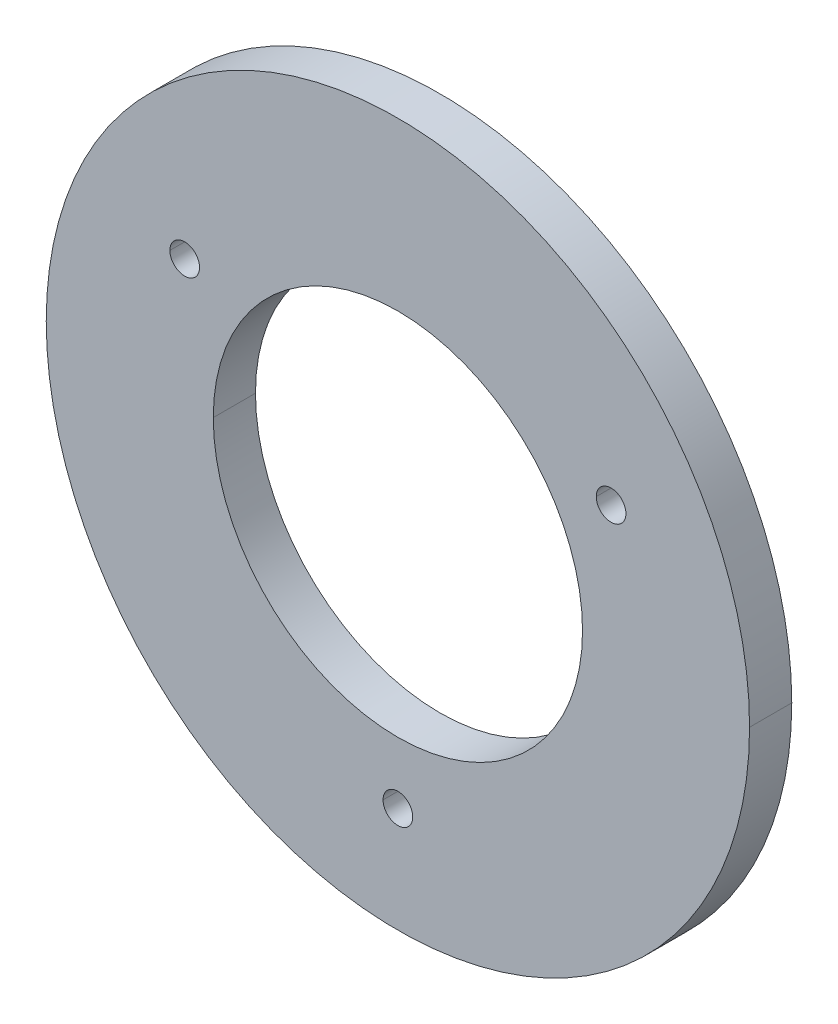
ISO-10303-21;
HEADER;
FILE_DESCRIPTION(('STEP AP214'),'2;1');
FILE_NAME('part.step','',(''),(''),'','','');
FILE_SCHEMA(('AUTOMOTIVE_DESIGN { 1 0 10303 214 1 1 1 1 }'));
ENDSEC;
DATA;
#1=APPLICATION_CONTEXT('core data for automotive mechanical design processes');
#2=APPLICATION_PROTOCOL_DEFINITION('international standard','automotive_design',2000,#1);
#3=PRODUCT_CONTEXT('',#1,'mechanical');
#4=PRODUCT('Part','Part','',(#3));
#5=PRODUCT_RELATED_PRODUCT_CATEGORY('part','',(#4));
#6=PRODUCT_DEFINITION_FORMATION('','',#4);
#7=PRODUCT_DEFINITION_CONTEXT('part definition',#1,'design');
#8=PRODUCT_DEFINITION('design','',#6,#7);
#9=PRODUCT_DEFINITION_SHAPE('','',#8);
#10=(LENGTH_UNIT() NAMED_UNIT(*) SI_UNIT(.MILLI.,.METRE.));
#11=(NAMED_UNIT(*) PLANE_ANGLE_UNIT() SI_UNIT($,.RADIAN.));
#12=(NAMED_UNIT(*) SI_UNIT($,.STERADIAN.) SOLID_ANGLE_UNIT());
#13=UNCERTAINTY_MEASURE_WITH_UNIT(LENGTH_MEASURE(1.E-05),#10,'distance_accuracy_value','');
#14=(GEOMETRIC_REPRESENTATION_CONTEXT(3) GLOBAL_UNCERTAINTY_ASSIGNED_CONTEXT((#13)) GLOBAL_UNIT_ASSIGNED_CONTEXT((#10,
#11,#12)) REPRESENTATION_CONTEXT('',''));
#15=CARTESIAN_POINT('',(0.,0.,0.));
#16=DIRECTION('',(0.,0.,1.));
#17=DIRECTION('',(1.,0.,0.));
#18=AXIS2_PLACEMENT_3D('',#15,#16,#17);
#19=CARTESIAN_POINT('',(6.2450045135165E-13,-88.9,0.));
#20=DIRECTION('',(0.,0.,1.));
#21=DIRECTION('',(1.,0.,0.));
#22=AXIS2_PLACEMENT_3D('',#19,#20,#21);
#23=CYLINDRICAL_SURFACE('',#22,5.35813);
#24=DIRECTION('',(0.,0.,1.));
#25=VECTOR('',#24,1.);
#26=CARTESIAN_POINT('',(-5.35812999999937,-88.9,0.));
#27=LINE('',#26,#25);
#28=CARTESIAN_POINT('',(-5.35812999999937,-88.9,-15.24));
#29=VERTEX_POINT('',#28);
#30=CARTESIAN_POINT('',(-5.35812999999936,-88.9,0.));
#31=VERTEX_POINT('',#30);
#32=EDGE_CURVE('E172',#29,#31,#27,.T.);
#33=ORIENTED_EDGE('',*,*,#32,.F.);
#34=CARTESIAN_POINT('',(6.2450045135165E-13,-88.9,-15.24));
#35=DIRECTION('',(0.,0.,1.));
#36=DIRECTION('',(1.,0.,0.));
#37=AXIS2_PLACEMENT_3D('',#34,#35,#36);
#38=CIRCLE('',#37,5.35813);
#39=CARTESIAN_POINT('',(5.35813000000062,-88.9,-15.24));
#40=VERTEX_POINT('',#39);
#41=EDGE_CURVE('E164',#40,#29,#38,.T.);
#42=ORIENTED_EDGE('',*,*,#41,.F.);
#43=DIRECTION('',(0.,0.,1.));
#44=VECTOR('',#43,1.);
#45=CARTESIAN_POINT('',(5.35813000000062,-88.9,0.));
#46=LINE('',#45,#44);
#47=CARTESIAN_POINT('',(5.35813000000061,-88.9,0.));
#48=VERTEX_POINT('',#47);
#49=EDGE_CURVE('E186',#40,#48,#46,.T.);
#50=ORIENTED_EDGE('',*,*,#49,.T.);
#51=CARTESIAN_POINT('',(6.2450045135165E-13,-88.9,0.));
#52=DIRECTION('',(0.,0.,1.));
#53=DIRECTION('',(1.,0.,0.));
#54=AXIS2_PLACEMENT_3D('',#51,#52,#53);
#55=CIRCLE('',#54,5.35813);
#56=EDGE_CURVE('E117',#48,#31,#55,.T.);
#57=ORIENTED_EDGE('',*,*,#56,.T.);
#58=EDGE_LOOP('',(#33,#42,#50,#57));
#59=FACE_BOUND('',#58,.T.);
#60=ADVANCED_FACE('F16',(#59),#23,.F.);
#61=CARTESIAN_POINT('',(-76.9896583964367,44.45,0.));
#62=DIRECTION('',(0.,0.,1.));
#63=DIRECTION('',(1.,0.,0.));
#64=AXIS2_PLACEMENT_3D('',#61,#62,#63);
#65=CYLINDRICAL_SURFACE('',#64,5.35813);
#66=DIRECTION('',(0.,0.,1.));
#67=VECTOR('',#66,1.);
#68=CARTESIAN_POINT('',(-82.3477883964367,44.45,0.));
#69=LINE('',#68,#67);
#70=CARTESIAN_POINT('',(-82.3477883964367,44.45,-15.24));
#71=VERTEX_POINT('',#70);
#72=CARTESIAN_POINT('',(-82.3477883964367,44.45,0.));
#73=VERTEX_POINT('',#72);
#74=EDGE_CURVE('E159',#71,#73,#69,.T.);
#75=ORIENTED_EDGE('',*,*,#74,.F.);
#76=CARTESIAN_POINT('',(-76.9896583964367,44.45,-15.24));
#77=DIRECTION('',(0.,0.,1.));
#78=DIRECTION('',(1.,0.,0.));
#79=AXIS2_PLACEMENT_3D('',#76,#77,#78);
#80=CIRCLE('',#79,5.35813);
#81=CARTESIAN_POINT('',(-71.6315283964367,44.45,-15.24));
#82=VERTEX_POINT('',#81);
#83=EDGE_CURVE('E160',#82,#71,#80,.T.);
#84=ORIENTED_EDGE('',*,*,#83,.F.);
#85=DIRECTION('',(0.,0.,1.));
#86=VECTOR('',#85,1.);
#87=CARTESIAN_POINT('',(-71.6315283964367,44.45,0.));
#88=LINE('',#87,#86);
#89=CARTESIAN_POINT('',(-71.6315283964367,44.45,0.));
#90=VERTEX_POINT('',#89);
#91=EDGE_CURVE('E146',#82,#90,#88,.T.);
#92=ORIENTED_EDGE('',*,*,#91,.T.);
#93=CARTESIAN_POINT('',(-76.9896583964367,44.45,0.));
#94=DIRECTION('',(0.,0.,1.));
#95=DIRECTION('',(1.,0.,0.));
#96=AXIS2_PLACEMENT_3D('',#93,#94,#95);
#97=CIRCLE('',#96,5.35813);
#98=EDGE_CURVE('E165',#90,#73,#97,.T.);
#99=ORIENTED_EDGE('',*,*,#98,.T.);
#100=EDGE_LOOP('',(#75,#84,#92,#99));
#101=FACE_BOUND('',#100,.T.);
#102=ADVANCED_FACE('F230',(#101),#65,.F.);
#103=CARTESIAN_POINT('',(76.9896583964367,44.45,0.));
#104=DIRECTION('',(0.,0.,1.));
#105=DIRECTION('',(1.,0.,0.));
#106=AXIS2_PLACEMENT_3D('',#103,#104,#105);
#107=CYLINDRICAL_SURFACE('',#106,5.35813);
#108=DIRECTION('',(0.,0.,1.));
#109=VECTOR('',#108,1.);
#110=CARTESIAN_POINT('',(71.6315283964367,44.45,0.));
#111=LINE('',#110,#109);
#112=CARTESIAN_POINT('',(71.6315283964367,44.45,-15.24));
#113=VERTEX_POINT('',#112);
#114=CARTESIAN_POINT('',(71.6315283964367,44.45,0.));
#115=VERTEX_POINT('',#114);
#116=EDGE_CURVE('E432',#113,#115,#111,.T.);
#117=ORIENTED_EDGE('',*,*,#116,.F.);
#118=CARTESIAN_POINT('',(76.9896583964367,44.45,-15.24));
#119=DIRECTION('',(0.,0.,1.));
#120=DIRECTION('',(1.,0.,0.));
#121=AXIS2_PLACEMENT_3D('',#118,#119,#120);
#122=CIRCLE('',#121,5.35813);
#123=CARTESIAN_POINT('',(82.3477883964367,44.45,-15.24));
#124=VERTEX_POINT('',#123);
#125=EDGE_CURVE('E118',#124,#113,#122,.T.);
#126=ORIENTED_EDGE('',*,*,#125,.F.);
#127=DIRECTION('',(0.,0.,1.));
#128=VECTOR('',#127,1.);
#129=CARTESIAN_POINT('',(82.3477883964367,44.45,0.));
#130=LINE('',#129,#128);
#131=CARTESIAN_POINT('',(82.3477883964367,44.45,0.));
#132=VERTEX_POINT('',#131);
#133=EDGE_CURVE('E131',#124,#132,#130,.T.);
#134=ORIENTED_EDGE('',*,*,#133,.T.);
#135=CARTESIAN_POINT('',(76.9896583964367,44.45,0.));
#136=DIRECTION('',(0.,0.,1.));
#137=DIRECTION('',(1.,0.,0.));
#138=AXIS2_PLACEMENT_3D('',#135,#136,#137);
#139=CIRCLE('',#138,5.35813);
#140=EDGE_CURVE('E27',#132,#115,#139,.T.);
#141=ORIENTED_EDGE('',*,*,#140,.T.);
#142=EDGE_LOOP('',(#117,#126,#134,#141));
#143=FACE_BOUND('',#142,.T.);
#144=ADVANCED_FACE('F18',(#143),#107,.F.);
#145=CARTESIAN_POINT('',(0.,0.,-15.24));
#146=DIRECTION('',(0.,0.,1.));
#147=DIRECTION('',(1.,0.,0.));
#148=AXIS2_PLACEMENT_3D('',#145,#146,#147);
#149=CYLINDRICAL_SURFACE('',#148,66.675);
#150=DIRECTION('',(0.,0.,1.));
#151=VECTOR('',#150,1.);
#152=CARTESIAN_POINT('',(-66.675,0.,-15.24));
#153=LINE('',#152,#151);
#154=CARTESIAN_POINT('',(-66.675,0.,-15.24));
#155=VERTEX_POINT('',#154);
#156=CARTESIAN_POINT('',(-66.675,0.,0.));
#157=VERTEX_POINT('',#156);
#158=EDGE_CURVE('E112',#155,#157,#153,.T.);
#159=ORIENTED_EDGE('',*,*,#158,.F.);
#160=CARTESIAN_POINT('',(0.,0.,-15.24));
#161=DIRECTION('',(0.,0.,1.));
#162=DIRECTION('',(1.,0.,0.));
#163=AXIS2_PLACEMENT_3D('',#160,#161,#162);
#164=CIRCLE('',#163,66.675);
#165=CARTESIAN_POINT('',(66.675,0.,-15.24));
#166=VERTEX_POINT('',#165);
#167=EDGE_CURVE('E106',#166,#155,#164,.T.);
#168=ORIENTED_EDGE('',*,*,#167,.F.);
#169=DIRECTION('',(0.,0.,1.));
#170=VECTOR('',#169,1.);
#171=CARTESIAN_POINT('',(66.675,0.,-15.24));
#172=LINE('',#171,#170);
#173=CARTESIAN_POINT('',(66.675,0.,0.));
#174=VERTEX_POINT('',#173);
#175=EDGE_CURVE('E109',#166,#174,#172,.T.);
#176=ORIENTED_EDGE('',*,*,#175,.T.);
#177=CARTESIAN_POINT('',(0.,0.,0.));
#178=DIRECTION('',(0.,0.,1.));
#179=DIRECTION('',(1.,0.,0.));
#180=AXIS2_PLACEMENT_3D('',#177,#178,#179);
#181=CIRCLE('',#180,66.675);
#182=EDGE_CURVE('E11',#174,#157,#181,.T.);
#183=ORIENTED_EDGE('',*,*,#182,.T.);
#184=EDGE_LOOP('',(#159,#168,#176,#183));
#185=FACE_BOUND('',#184,.T.);
#186=ADVANCED_FACE('F108',(#185),#149,.F.);
#187=CARTESIAN_POINT('',(0.,0.,0.));
#188=DIRECTION('',(0.,0.,1.));
#189=DIRECTION('',(1.,0.,0.));
#190=AXIS2_PLACEMENT_3D('',#187,#188,#189);
#191=PLANE('',#190);
#192=ORIENTED_EDGE('',*,*,#182,.F.);
#193=CARTESIAN_POINT('',(0.,0.,0.));
#194=DIRECTION('',(0.,0.,1.));
#195=DIRECTION('',(1.,0.,0.));
#196=AXIS2_PLACEMENT_3D('',#193,#194,#195);
#197=CIRCLE('',#196,66.675);
#198=EDGE_CURVE('E124',#157,#174,#197,.T.);
#199=ORIENTED_EDGE('',*,*,#198,.F.);
#200=EDGE_LOOP('',(#192,#199));
#201=FACE_BOUND('',#200,.T.);
#202=ORIENTED_EDGE('',*,*,#140,.F.);
#203=CARTESIAN_POINT('',(76.9896583964367,44.45,0.));
#204=DIRECTION('',(0.,0.,1.));
#205=DIRECTION('',(1.,0.,0.));
#206=AXIS2_PLACEMENT_3D('',#203,#204,#205);
#207=CIRCLE('',#206,5.35813);
#208=EDGE_CURVE('E140',#115,#132,#207,.T.);
#209=ORIENTED_EDGE('',*,*,#208,.F.);
#210=EDGE_LOOP('',(#202,#209));
#211=FACE_BOUND('',#210,.T.);
#212=ORIENTED_EDGE('',*,*,#98,.F.);
#213=CARTESIAN_POINT('',(-76.9896583964367,44.45,0.));
#214=DIRECTION('',(0.,0.,1.));
#215=DIRECTION('',(1.,0.,0.));
#216=AXIS2_PLACEMENT_3D('',#213,#214,#215);
#217=CIRCLE('',#216,5.35813);
#218=EDGE_CURVE('E150',#73,#90,#217,.T.);
#219=ORIENTED_EDGE('',*,*,#218,.F.);
#220=EDGE_LOOP('',(#212,#219));
#221=FACE_BOUND('',#220,.T.);
#222=ORIENTED_EDGE('',*,*,#56,.F.);
#223=CARTESIAN_POINT('',(6.2450045135165E-13,-88.9,0.));
#224=DIRECTION('',(0.,0.,1.));
#225=DIRECTION('',(1.,0.,0.));
#226=AXIS2_PLACEMENT_3D('',#223,#224,#225);
#227=CIRCLE('',#226,5.35813);
#228=EDGE_CURVE('E176',#31,#48,#227,.T.);
#229=ORIENTED_EDGE('',*,*,#228,.F.);
#230=EDGE_LOOP('',(#222,#229));
#231=FACE_BOUND('',#230,.T.);
#232=CARTESIAN_POINT('',(0.,0.,0.));
#233=DIRECTION('',(0.,0.,1.));
#234=DIRECTION('',(1.,0.,0.));
#235=AXIS2_PLACEMENT_3D('',#232,#233,#234);
#236=CIRCLE('',#235,127.);
#237=CARTESIAN_POINT('',(127.,0.,0.));
#238=VERTEX_POINT('',#237);
#239=CARTESIAN_POINT('',(-127.,0.,0.));
#240=VERTEX_POINT('',#239);
#241=EDGE_CURVE('E200',#238,#240,#236,.T.);
#242=ORIENTED_EDGE('',*,*,#241,.T.);
#243=CARTESIAN_POINT('',(0.,0.,0.));
#244=DIRECTION('',(0.,0.,1.));
#245=DIRECTION('',(1.,0.,0.));
#246=AXIS2_PLACEMENT_3D('',#243,#244,#245);
#247=CIRCLE('',#246,127.);
#248=EDGE_CURVE('E41',#240,#238,#247,.T.);
#249=ORIENTED_EDGE('',*,*,#248,.T.);
#250=EDGE_LOOP('',(#242,#249));
#251=FACE_BOUND('',#250,.T.);
#252=ADVANCED_FACE('F218',(#201,#211,#221,#231,#251),#191,.T.);
#253=CARTESIAN_POINT('',(0.,0.,-15.24));
#254=DIRECTION('',(0.,0.,1.));
#255=DIRECTION('',(1.,0.,0.));
#256=AXIS2_PLACEMENT_3D('',#253,#254,#255);
#257=PLANE('',#256);
#258=ORIENTED_EDGE('',*,*,#167,.T.);
#259=CARTESIAN_POINT('',(0.,0.,-15.24));
#260=DIRECTION('',(0.,0.,1.));
#261=DIRECTION('',(1.,0.,0.));
#262=AXIS2_PLACEMENT_3D('',#259,#260,#261);
#263=CIRCLE('',#262,66.675);
#264=EDGE_CURVE('E122',#155,#166,#263,.T.);
#265=ORIENTED_EDGE('',*,*,#264,.T.);
#266=EDGE_LOOP('',(#258,#265));
#267=FACE_BOUND('',#266,.T.);
#268=ORIENTED_EDGE('',*,*,#125,.T.);
#269=CARTESIAN_POINT('',(76.9896583964367,44.45,-15.24));
#270=DIRECTION('',(0.,0.,1.));
#271=DIRECTION('',(1.,0.,0.));
#272=AXIS2_PLACEMENT_3D('',#269,#270,#271);
#273=CIRCLE('',#272,5.35813);
#274=EDGE_CURVE('E149',#113,#124,#273,.T.);
#275=ORIENTED_EDGE('',*,*,#274,.T.);
#276=EDGE_LOOP('',(#268,#275));
#277=FACE_BOUND('',#276,.T.);
#278=ORIENTED_EDGE('',*,*,#83,.T.);
#279=CARTESIAN_POINT('',(-76.9896583964367,44.45,-15.24));
#280=DIRECTION('',(0.,0.,1.));
#281=DIRECTION('',(1.,0.,0.));
#282=AXIS2_PLACEMENT_3D('',#279,#280,#281);
#283=CIRCLE('',#282,5.35813);
#284=EDGE_CURVE('E20',#71,#82,#283,.T.);
#285=ORIENTED_EDGE('',*,*,#284,.T.);
#286=EDGE_LOOP('',(#278,#285));
#287=FACE_BOUND('',#286,.T.);
#288=ORIENTED_EDGE('',*,*,#41,.T.);
#289=CARTESIAN_POINT('',(6.2450045135165E-13,-88.9,-15.24));
#290=DIRECTION('',(0.,0.,1.));
#291=DIRECTION('',(1.,0.,0.));
#292=AXIS2_PLACEMENT_3D('',#289,#290,#291);
#293=CIRCLE('',#292,5.35813);
#294=EDGE_CURVE('E177',#29,#40,#293,.T.);
#295=ORIENTED_EDGE('',*,*,#294,.T.);
#296=EDGE_LOOP('',(#288,#295));
#297=FACE_BOUND('',#296,.T.);
#298=CARTESIAN_POINT('',(0.,0.,-15.24));
#299=DIRECTION('',(0.,0.,1.));
#300=DIRECTION('',(1.,0.,0.));
#301=AXIS2_PLACEMENT_3D('',#298,#299,#300);
#302=CIRCLE('',#301,127.);
#303=CARTESIAN_POINT('',(127.,0.,-15.24));
#304=VERTEX_POINT('',#303);
#305=CARTESIAN_POINT('',(-127.,0.,-15.24));
#306=VERTEX_POINT('',#305);
#307=EDGE_CURVE('E126',#304,#306,#302,.T.);
#308=ORIENTED_EDGE('',*,*,#307,.F.);
#309=CARTESIAN_POINT('',(0.,0.,-15.24));
#310=DIRECTION('',(0.,0.,1.));
#311=DIRECTION('',(1.,0.,0.));
#312=AXIS2_PLACEMENT_3D('',#309,#310,#311);
#313=CIRCLE('',#312,127.);
#314=EDGE_CURVE('E170',#306,#304,#313,.T.);
#315=ORIENTED_EDGE('',*,*,#314,.F.);
#316=EDGE_LOOP('',(#308,#315));
#317=FACE_BOUND('',#316,.T.);
#318=ADVANCED_FACE('F128',(#267,#277,#287,#297,#317),#257,.F.);
#319=CARTESIAN_POINT('',(0.,0.,-15.24));
#320=DIRECTION('',(0.,0.,1.));
#321=DIRECTION('',(1.,0.,0.));
#322=AXIS2_PLACEMENT_3D('',#319,#320,#321);
#323=CYLINDRICAL_SURFACE('',#322,127.);
#324=DIRECTION('',(0.,0.,1.));
#325=VECTOR('',#324,1.);
#326=CARTESIAN_POINT('',(-127.,0.,-15.24));
#327=LINE('',#326,#325);
#328=EDGE_CURVE('E155',#306,#240,#327,.T.);
#329=ORIENTED_EDGE('',*,*,#328,.F.);
#330=ORIENTED_EDGE('',*,*,#314,.T.);
#331=DIRECTION('',(0.,0.,1.));
#332=VECTOR('',#331,1.);
#333=CARTESIAN_POINT('',(127.,0.,-15.24));
#334=LINE('',#333,#332);
#335=EDGE_CURVE('E144',#304,#238,#334,.T.);
#336=ORIENTED_EDGE('',*,*,#335,.T.);
#337=ORIENTED_EDGE('',*,*,#248,.F.);
#338=EDGE_LOOP('',(#329,#330,#336,#337));
#339=FACE_BOUND('',#338,.T.);
#340=ADVANCED_FACE('F212',(#339),#323,.T.);
#341=CARTESIAN_POINT('',(0.,0.,-15.24));
#342=DIRECTION('',(0.,0.,1.));
#343=DIRECTION('',(1.,0.,0.));
#344=AXIS2_PLACEMENT_3D('',#341,#342,#343);
#345=CYLINDRICAL_SURFACE('',#344,127.);
#346=ORIENTED_EDGE('',*,*,#307,.T.);
#347=ORIENTED_EDGE('',*,*,#328,.T.);
#348=ORIENTED_EDGE('',*,*,#241,.F.);
#349=ORIENTED_EDGE('',*,*,#335,.F.);
#350=EDGE_LOOP('',(#346,#347,#348,#349));
#351=FACE_BOUND('',#350,.T.);
#352=ADVANCED_FACE('F215',(#351),#345,.T.);
#353=CARTESIAN_POINT('',(0.,0.,-15.24));
#354=DIRECTION('',(0.,0.,1.));
#355=DIRECTION('',(1.,0.,0.));
#356=AXIS2_PLACEMENT_3D('',#353,#354,#355);
#357=CYLINDRICAL_SURFACE('',#356,66.675);
#358=ORIENTED_EDGE('',*,*,#264,.F.);
#359=ORIENTED_EDGE('',*,*,#158,.T.);
#360=ORIENTED_EDGE('',*,*,#198,.T.);
#361=ORIENTED_EDGE('',*,*,#175,.F.);
#362=EDGE_LOOP('',(#358,#359,#360,#361));
#363=FACE_BOUND('',#362,.T.);
#364=ADVANCED_FACE('F121',(#363),#357,.F.);
#365=CARTESIAN_POINT('',(76.9896583964367,44.45,0.));
#366=DIRECTION('',(0.,0.,1.));
#367=DIRECTION('',(1.,0.,0.));
#368=AXIS2_PLACEMENT_3D('',#365,#366,#367);
#369=CYLINDRICAL_SURFACE('',#368,5.35813);
#370=ORIENTED_EDGE('',*,*,#274,.F.);
#371=ORIENTED_EDGE('',*,*,#116,.T.);
#372=ORIENTED_EDGE('',*,*,#208,.T.);
#373=ORIENTED_EDGE('',*,*,#133,.F.);
#374=EDGE_LOOP('',(#370,#371,#372,#373));
#375=FACE_BOUND('',#374,.T.);
#376=ADVANCED_FACE('F240',(#375),#369,.F.);
#377=CARTESIAN_POINT('',(-76.9896583964367,44.45,0.));
#378=DIRECTION('',(0.,0.,1.));
#379=DIRECTION('',(1.,0.,0.));
#380=AXIS2_PLACEMENT_3D('',#377,#378,#379);
#381=CYLINDRICAL_SURFACE('',#380,5.35813);
#382=ORIENTED_EDGE('',*,*,#284,.F.);
#383=ORIENTED_EDGE('',*,*,#74,.T.);
#384=ORIENTED_EDGE('',*,*,#218,.T.);
#385=ORIENTED_EDGE('',*,*,#91,.F.);
#386=EDGE_LOOP('',(#382,#383,#384,#385));
#387=FACE_BOUND('',#386,.T.);
#388=ADVANCED_FACE('F243',(#387),#381,.F.);
#389=CARTESIAN_POINT('',(6.2450045135165E-13,-88.9,0.));
#390=DIRECTION('',(0.,0.,1.));
#391=DIRECTION('',(1.,0.,0.));
#392=AXIS2_PLACEMENT_3D('',#389,#390,#391);
#393=CYLINDRICAL_SURFACE('',#392,5.35813);
#394=ORIENTED_EDGE('',*,*,#294,.F.);
#395=ORIENTED_EDGE('',*,*,#32,.T.);
#396=ORIENTED_EDGE('',*,*,#228,.T.);
#397=ORIENTED_EDGE('',*,*,#49,.F.);
#398=EDGE_LOOP('',(#394,#395,#396,#397));
#399=FACE_BOUND('',#398,.T.);
#400=ADVANCED_FACE('F245',(#399),#393,.F.);
#401=CLOSED_SHELL('',(#60,#102,#144,#186,#252,#318,#340,#352,#364,#376,#388,#400));
#402=MANIFOLD_SOLID_BREP('B1',#401);
#403=ADVANCED_BREP_SHAPE_REPRESENTATION('',(#18,#402),#14);
#404=SHAPE_DEFINITION_REPRESENTATION(#9,#403);
ENDSEC;
END-ISO-10303-21;
